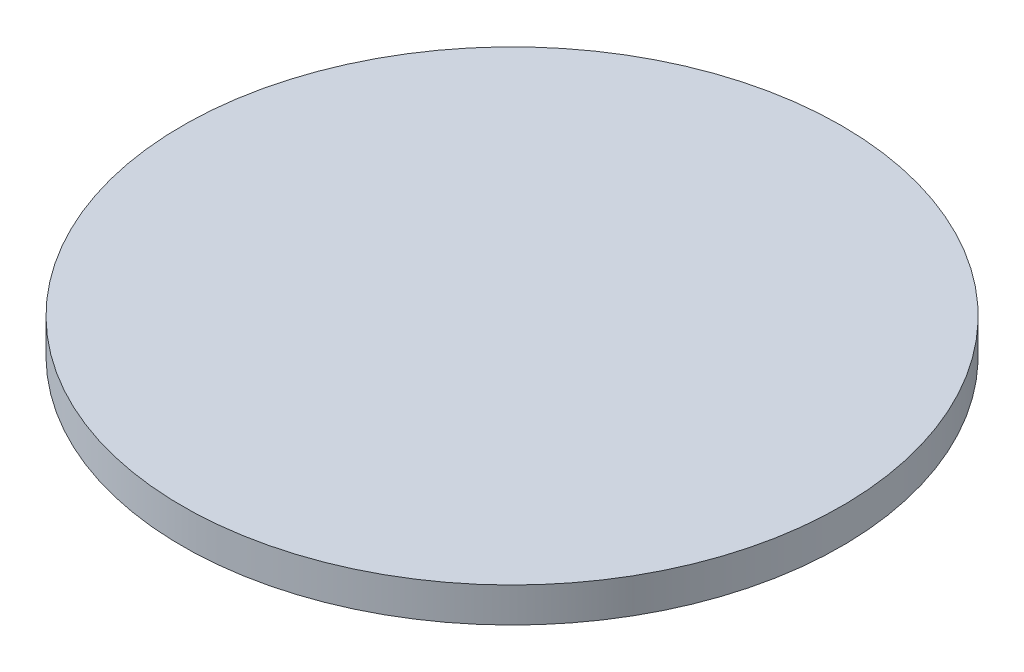
ISO-10303-21;
HEADER;
FILE_DESCRIPTION(('STEP AP214'),'2;1');
FILE_NAME('part.step','',(''),(''),'','','');
FILE_SCHEMA(('AUTOMOTIVE_DESIGN { 1 0 10303 214 1 1 1 1 }'));
ENDSEC;
DATA;
#1=APPLICATION_CONTEXT('core data for automotive mechanical design processes');
#2=APPLICATION_PROTOCOL_DEFINITION('international standard','automotive_design',2000,#1);
#3=PRODUCT_CONTEXT('',#1,'mechanical');
#4=PRODUCT('Part','Part','',(#3));
#5=PRODUCT_RELATED_PRODUCT_CATEGORY('part','',(#4));
#6=PRODUCT_DEFINITION_FORMATION('','',#4);
#7=PRODUCT_DEFINITION_CONTEXT('part definition',#1,'design');
#8=PRODUCT_DEFINITION('design','',#6,#7);
#9=PRODUCT_DEFINITION_SHAPE('','',#8);
#10=(LENGTH_UNIT() NAMED_UNIT(*) SI_UNIT(.MILLI.,.METRE.));
#11=(NAMED_UNIT(*) PLANE_ANGLE_UNIT() SI_UNIT($,.RADIAN.));
#12=(NAMED_UNIT(*) SI_UNIT($,.STERADIAN.) SOLID_ANGLE_UNIT());
#13=UNCERTAINTY_MEASURE_WITH_UNIT(LENGTH_MEASURE(1.E-05),#10,'distance_accuracy_value','');
#14=(GEOMETRIC_REPRESENTATION_CONTEXT(3) GLOBAL_UNCERTAINTY_ASSIGNED_CONTEXT((#13)) GLOBAL_UNIT_ASSIGNED_CONTEXT((#10,
#11,#12)) REPRESENTATION_CONTEXT('',''));
#15=CARTESIAN_POINT('',(0.,0.,0.));
#16=DIRECTION('',(0.,0.,1.));
#17=DIRECTION('',(1.,0.,0.));
#18=AXIS2_PLACEMENT_3D('',#15,#16,#17);
#19=CARTESIAN_POINT('',(-2.1,0.,0.));
#20=DIRECTION('',(0.,1.,0.));
#21=DIRECTION('',(0.,0.,1.));
#22=AXIS2_PLACEMENT_3D('',#19,#20,#21);
#23=PLANE('',#22);
#24=CARTESIAN_POINT('',(0.,0.,0.));
#25=DIRECTION('',(0.,-1.,0.));
#26=DIRECTION('',(0.,0.,-1.));
#27=AXIS2_PLACEMENT_3D('',#24,#25,#26);
#28=CIRCLE('',#27,2.1);
#29=CARTESIAN_POINT('',(0.,0.,-2.1));
#30=VERTEX_POINT('',#29);
#31=EDGE_CURVE('E55',#30,#30,#28,.T.);
#32=ORIENTED_EDGE('',*,*,#31,.T.);
#33=EDGE_LOOP('',(#32));
#34=FACE_BOUND('',#33,.T.);
#35=ADVANCED_FACE('F33',(#34),#23,.F.);
#36=CARTESIAN_POINT('',(-9.5,6.,0.));
#37=DIRECTION('',(0.,-1.,0.));
#38=DIRECTION('',(0.,0.,-1.));
#39=AXIS2_PLACEMENT_3D('',#36,#37,#38);
#40=PLANE('',#39);
#41=CARTESIAN_POINT('',(0.,6.,0.));
#42=DIRECTION('',(0.,-1.,0.));
#43=DIRECTION('',(0.,0.,-1.));
#44=AXIS2_PLACEMENT_3D('',#41,#42,#43);
#45=CIRCLE('',#44,9.5);
#46=CARTESIAN_POINT('',(0.,6.,-9.5));
#47=VERTEX_POINT('',#46);
#48=EDGE_CURVE('E10',#47,#47,#45,.T.);
#49=ORIENTED_EDGE('',*,*,#48,.F.);
#50=EDGE_LOOP('',(#49));
#51=FACE_BOUND('',#50,.T.);
#52=ADVANCED_FACE('F85',(#51),#40,.F.);
#53=CARTESIAN_POINT('',(0.,0.,0.));
#54=DIRECTION('',(0.,-1.,0.));
#55=DIRECTION('',(0.,0.,-1.));
#56=AXIS2_PLACEMENT_3D('',#53,#54,#55);
#57=CYLINDRICAL_SURFACE('',#56,9.5);
#58=CARTESIAN_POINT('',(0.,5.,0.));
#59=DIRECTION('',(0.,-1.,0.));
#60=DIRECTION('',(0.,0.,-1.));
#61=AXIS2_PLACEMENT_3D('',#58,#59,#60);
#62=CIRCLE('',#61,9.5);
#63=CARTESIAN_POINT('',(0.,5.,-9.5));
#64=VERTEX_POINT('',#63);
#65=EDGE_CURVE('E39',#64,#64,#62,.T.);
#66=ORIENTED_EDGE('',*,*,#65,.F.);
#67=EDGE_LOOP('',(#66));
#68=FACE_BOUND('',#67,.T.);
#69=ORIENTED_EDGE('',*,*,#48,.T.);
#70=EDGE_LOOP('',(#69));
#71=FACE_BOUND('',#70,.T.);
#72=ADVANCED_FACE('F80',(#68,#71),#57,.T.);
#73=CARTESIAN_POINT('',(-2.1,5.,0.));
#74=DIRECTION('',(0.,1.,0.));
#75=DIRECTION('',(0.,0.,1.));
#76=AXIS2_PLACEMENT_3D('',#73,#74,#75);
#77=PLANE('',#76);
#78=CARTESIAN_POINT('',(0.,5.,0.));
#79=DIRECTION('',(0.,-1.,0.));
#80=DIRECTION('',(0.,0.,-1.));
#81=AXIS2_PLACEMENT_3D('',#78,#79,#80);
#82=CIRCLE('',#81,2.1);
#83=CARTESIAN_POINT('',(0.,5.,-2.1));
#84=VERTEX_POINT('',#83);
#85=EDGE_CURVE('E43',#84,#84,#82,.T.);
#86=ORIENTED_EDGE('',*,*,#85,.F.);
#87=EDGE_LOOP('',(#86));
#88=FACE_BOUND('',#87,.T.);
#89=ORIENTED_EDGE('',*,*,#65,.T.);
#90=EDGE_LOOP('',(#89));
#91=FACE_BOUND('',#90,.T.);
#92=ADVANCED_FACE('F75',(#88,#91),#77,.F.);
#93=CARTESIAN_POINT('',(0.,0.,0.));
#94=DIRECTION('',(0.,-1.,0.));
#95=DIRECTION('',(0.,0.,-1.));
#96=AXIS2_PLACEMENT_3D('',#93,#94,#95);
#97=CYLINDRICAL_SURFACE('',#96,2.1);
#98=CARTESIAN_POINT('',(0.,3.,0.));
#99=DIRECTION('',(0.,-1.,0.));
#100=DIRECTION('',(0.,0.,-1.));
#101=AXIS2_PLACEMENT_3D('',#98,#99,#100);
#102=CIRCLE('',#101,2.1);
#103=CARTESIAN_POINT('',(0.,3.,-2.1));
#104=VERTEX_POINT('',#103);
#105=EDGE_CURVE('E47',#104,#104,#102,.T.);
#106=ORIENTED_EDGE('',*,*,#105,.F.);
#107=EDGE_LOOP('',(#106));
#108=FACE_BOUND('',#107,.T.);
#109=ORIENTED_EDGE('',*,*,#85,.T.);
#110=EDGE_LOOP('',(#109));
#111=FACE_BOUND('',#110,.T.);
#112=ADVANCED_FACE('F69',(#108,#111),#97,.T.);
#113=CARTESIAN_POINT('',(-3.,3.,0.));
#114=DIRECTION('',(0.,-1.,0.));
#115=DIRECTION('',(0.,0.,-1.));
#116=AXIS2_PLACEMENT_3D('',#113,#114,#115);
#117=PLANE('',#116);
#118=CARTESIAN_POINT('',(0.,3.,0.));
#119=DIRECTION('',(0.,-1.,0.));
#120=DIRECTION('',(0.,0.,-1.));
#121=AXIS2_PLACEMENT_3D('',#118,#119,#120);
#122=CIRCLE('',#121,3.);
#123=CARTESIAN_POINT('',(0.,3.,-3.));
#124=VERTEX_POINT('',#123);
#125=EDGE_CURVE('E52',#124,#124,#122,.T.);
#126=ORIENTED_EDGE('',*,*,#125,.F.);
#127=EDGE_LOOP('',(#126));
#128=FACE_BOUND('',#127,.T.);
#129=ORIENTED_EDGE('',*,*,#105,.T.);
#130=EDGE_LOOP('',(#129));
#131=FACE_BOUND('',#130,.T.);
#132=ADVANCED_FACE('F63',(#128,#131),#117,.F.);
#133=CARTESIAN_POINT('',(0.,3.,0.));
#134=DIRECTION('',(0.,1.,0.));
#135=DIRECTION('',(0.,0.,1.));
#136=AXIS2_PLACEMENT_3D('',#133,#134,#135);
#137=CONICAL_SURFACE('',#136,3.,0.291456794477866);
#138=ORIENTED_EDGE('',*,*,#31,.F.);
#139=EDGE_LOOP('',(#138));
#140=FACE_BOUND('',#139,.T.);
#141=ORIENTED_EDGE('',*,*,#125,.T.);
#142=EDGE_LOOP('',(#141));
#143=FACE_BOUND('',#142,.T.);
#144=ADVANCED_FACE('F60',(#140,#143),#137,.T.);
#145=CLOSED_SHELL('',(#35,#52,#72,#92,#112,#132,#144));
#146=MANIFOLD_SOLID_BREP('B2',#145);
#147=ADVANCED_BREP_SHAPE_REPRESENTATION('',(#18,#146),#14);
#148=SHAPE_DEFINITION_REPRESENTATION(#9,#147);
ENDSEC;
END-ISO-10303-21;
